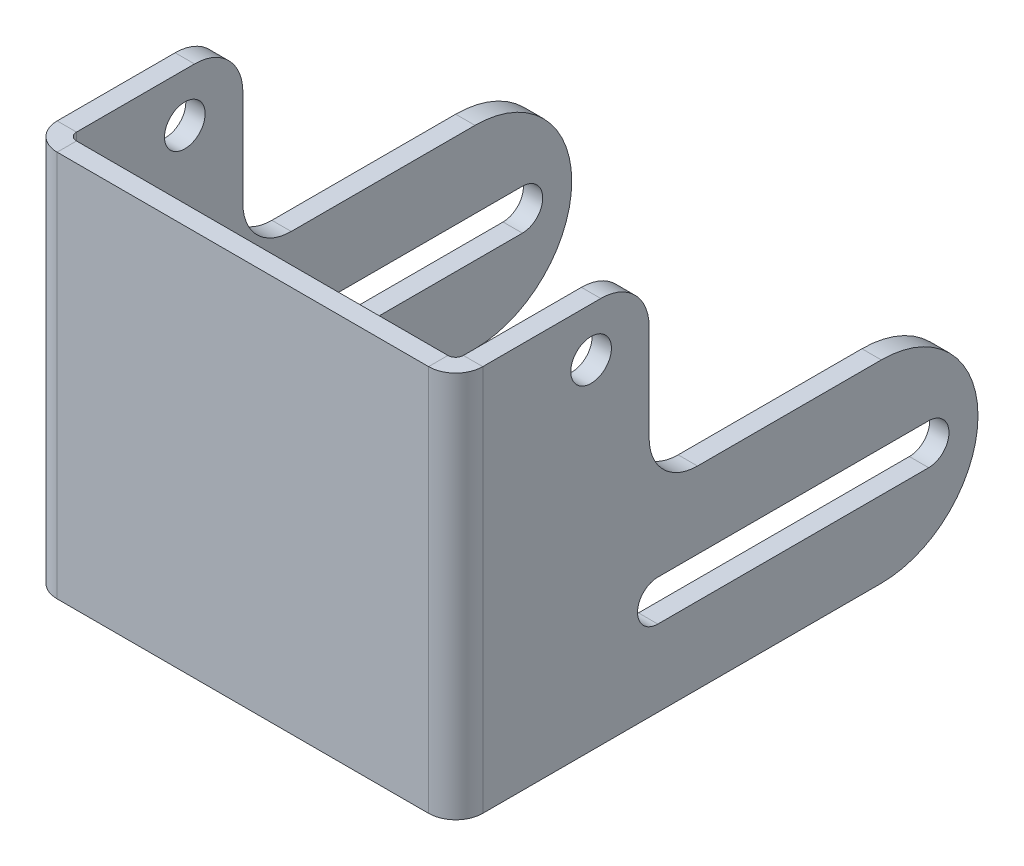
ISO-10303-21;
HEADER;
FILE_DESCRIPTION(('STEP AP214'),'2;1');
FILE_NAME('part.step','',(''),(''),'','','');
FILE_SCHEMA(('AUTOMOTIVE_DESIGN { 1 0 10303 214 1 1 1 1 }'));
ENDSEC;
DATA;
#1=APPLICATION_CONTEXT('core data for automotive mechanical design processes');
#2=APPLICATION_PROTOCOL_DEFINITION('international standard','automotive_design',2000,#1);
#3=PRODUCT_CONTEXT('',#1,'mechanical');
#4=PRODUCT('Part','Part','',(#3));
#5=PRODUCT_RELATED_PRODUCT_CATEGORY('part','',(#4));
#6=PRODUCT_DEFINITION_FORMATION('','',#4);
#7=PRODUCT_DEFINITION_CONTEXT('part definition',#1,'design');
#8=PRODUCT_DEFINITION('design','',#6,#7);
#9=PRODUCT_DEFINITION_SHAPE('','',#8);
#10=(LENGTH_UNIT() NAMED_UNIT(*) SI_UNIT(.MILLI.,.METRE.));
#11=(NAMED_UNIT(*) PLANE_ANGLE_UNIT() SI_UNIT($,.RADIAN.));
#12=(NAMED_UNIT(*) SI_UNIT($,.STERADIAN.) SOLID_ANGLE_UNIT());
#13=UNCERTAINTY_MEASURE_WITH_UNIT(LENGTH_MEASURE(1.E-05),#10,'distance_accuracy_value','');
#14=(GEOMETRIC_REPRESENTATION_CONTEXT(3) GLOBAL_UNCERTAINTY_ASSIGNED_CONTEXT((#13)) GLOBAL_UNIT_ASSIGNED_CONTEXT((#10,
#11,#12)) REPRESENTATION_CONTEXT('',''));
#15=CARTESIAN_POINT('',(0.,0.,0.));
#16=DIRECTION('',(0.,0.,1.));
#17=DIRECTION('',(1.,0.,0.));
#18=AXIS2_PLACEMENT_3D('',#15,#16,#17);
#19=CARTESIAN_POINT('',(-19.2,40.,0.));
#20=DIRECTION('',(0.,1.,0.));
#21=DIRECTION('',(0.,0.,1.));
#22=AXIS2_PLACEMENT_3D('',#19,#20,#21);
#23=PLANE('',#22);
#24=DIRECTION('',(0.,0.,1.));
#25=VECTOR('',#24,1.);
#26=CARTESIAN_POINT('',(-19.2,40.,0.));
#27=LINE('',#26,#25);
#28=CARTESIAN_POINT('',(-19.2,40.,0.));
#29=VERTEX_POINT('',#28);
#30=CARTESIAN_POINT('',(-19.2,40.,1.99999999999999));
#31=VERTEX_POINT('',#30);
#32=EDGE_CURVE('E412',#29,#31,#27,.T.);
#33=ORIENTED_EDGE('',*,*,#32,.F.);
#34=CARTESIAN_POINT('',(-19.2,40.,-0.800000000000008));
#35=DIRECTION('',(0.,-1.,0.));
#36=DIRECTION('',(0.,0.,-1.));
#37=AXIS2_PLACEMENT_3D('',#34,#35,#36);
#38=CIRCLE('',#37,0.8);
#39=CARTESIAN_POINT('',(-20.,40.,-0.800000000000037));
#40=VERTEX_POINT('',#39);
#41=EDGE_CURVE('E343',#29,#40,#38,.T.);
#42=ORIENTED_EDGE('',*,*,#41,.T.);
#43=DIRECTION('',(1.,0.,0.));
#44=VECTOR('',#43,1.);
#45=CARTESIAN_POINT('',(-22.,40.,-0.800000000000037));
#46=LINE('',#45,#44);
#47=CARTESIAN_POINT('',(-22.,40.,-0.800000000000037));
#48=VERTEX_POINT('',#47);
#49=EDGE_CURVE('E410',#48,#40,#46,.T.);
#50=ORIENTED_EDGE('',*,*,#49,.F.);
#51=CARTESIAN_POINT('',(-19.2,40.,-0.800000000000008));
#52=DIRECTION('',(0.,1.,0.));
#53=DIRECTION('',(1.,0.,0.));
#54=AXIS2_PLACEMENT_3D('',#51,#52,#53);
#55=CIRCLE('',#54,2.8);
#56=EDGE_CURVE('E324',#31,#48,#55,.F.);
#57=ORIENTED_EDGE('',*,*,#56,.F.);
#58=EDGE_LOOP('',(#33,#42,#50,#57));
#59=FACE_BOUND('',#58,.T.);
#60=ADVANCED_FACE('F37',(#59),#23,.T.);
#61=CARTESIAN_POINT('',(-22.,40.,-0.800000000000037));
#62=DIRECTION('',(0.,1.,0.));
#63=DIRECTION('',(0.,0.,1.));
#64=AXIS2_PLACEMENT_3D('',#61,#62,#63);
#65=PLANE('',#64);
#66=DIRECTION('',(-1.,0.,0.));
#67=VECTOR('',#66,1.);
#68=CARTESIAN_POINT('',(-20.,40.,0.));
#69=LINE('',#68,#67);
#70=CARTESIAN_POINT('',(19.2,40.,0.));
#71=VERTEX_POINT('',#70);
#72=EDGE_CURVE('E340',#71,#29,#69,.T.);
#73=ORIENTED_EDGE('',*,*,#72,.T.);
#74=ORIENTED_EDGE('',*,*,#32,.T.);
#75=DIRECTION('',(1.,0.,0.));
#76=VECTOR('',#75,1.);
#77=CARTESIAN_POINT('',(-20.,40.,2.));
#78=LINE('',#77,#76);
#79=CARTESIAN_POINT('',(19.2,40.,2.));
#80=VERTEX_POINT('',#79);
#81=EDGE_CURVE('E327',#80,#31,#78,.F.);
#82=ORIENTED_EDGE('',*,*,#81,.F.);
#83=DIRECTION('',(0.,0.,-1.));
#84=VECTOR('',#83,1.);
#85=CARTESIAN_POINT('',(19.2,40.,2.));
#86=LINE('',#85,#84);
#87=EDGE_CURVE('E401',#80,#71,#86,.T.);
#88=ORIENTED_EDGE('',*,*,#87,.T.);
#89=EDGE_LOOP('',(#73,#74,#82,#88));
#90=FACE_BOUND('',#89,.T.);
#91=ADVANCED_FACE('F528',(#90),#65,.T.);
#92=CARTESIAN_POINT('',(-20.,0.,-0.800000000000037));
#93=DIRECTION('',(0.,-1.,0.));
#94=DIRECTION('',(0.,0.,-1.));
#95=AXIS2_PLACEMENT_3D('',#92,#93,#94);
#96=PLANE('',#95);
#97=DIRECTION('',(-1.,0.,0.));
#98=VECTOR('',#97,1.);
#99=CARTESIAN_POINT('',(-20.,0.,-0.800000000000037));
#100=LINE('',#99,#98);
#101=CARTESIAN_POINT('',(-20.,0.,-0.800000000000037));
#102=VERTEX_POINT('',#101);
#103=CARTESIAN_POINT('',(-22.,0.,-0.800000000000037));
#104=VERTEX_POINT('',#103);
#105=EDGE_CURVE('E408',#102,#104,#100,.T.);
#106=ORIENTED_EDGE('',*,*,#105,.F.);
#107=CARTESIAN_POINT('',(-19.2,0.,-0.800000000000008));
#108=DIRECTION('',(0.,-1.,0.));
#109=DIRECTION('',(0.,0.,-1.));
#110=AXIS2_PLACEMENT_3D('',#107,#108,#109);
#111=CIRCLE('',#110,0.8);
#112=CARTESIAN_POINT('',(-19.2,0.,0.));
#113=VERTEX_POINT('',#112);
#114=EDGE_CURVE('E321',#113,#102,#111,.T.);
#115=ORIENTED_EDGE('',*,*,#114,.F.);
#116=DIRECTION('',(0.,0.,-1.));
#117=VECTOR('',#116,1.);
#118=CARTESIAN_POINT('',(-19.2,0.,1.99999999999999));
#119=LINE('',#118,#117);
#120=CARTESIAN_POINT('',(-19.2,0.,1.99999999999999));
#121=VERTEX_POINT('',#120);
#122=EDGE_CURVE('E406',#121,#113,#119,.T.);
#123=ORIENTED_EDGE('',*,*,#122,.F.);
#124=CARTESIAN_POINT('',(-19.2,0.,-0.800000000000008));
#125=DIRECTION('',(0.,1.,0.));
#126=DIRECTION('',(1.,0.,0.));
#127=AXIS2_PLACEMENT_3D('',#124,#125,#126);
#128=CIRCLE('',#127,2.8);
#129=EDGE_CURVE('E352',#121,#104,#128,.F.);
#130=ORIENTED_EDGE('',*,*,#129,.T.);
#131=EDGE_LOOP('',(#106,#115,#123,#130));
#132=FACE_BOUND('',#131,.T.);
#133=ADVANCED_FACE('F534',(#132),#96,.T.);
#134=CARTESIAN_POINT('',(-19.2,0.,1.99999999999999));
#135=DIRECTION('',(0.,-1.,0.));
#136=DIRECTION('',(0.,0.,-1.));
#137=AXIS2_PLACEMENT_3D('',#134,#135,#136);
#138=PLANE('',#137);
#139=DIRECTION('',(0.,0.,-1.));
#140=VECTOR('',#139,1.);
#141=CARTESIAN_POINT('',(-22.,0.,-52.));
#142=LINE('',#141,#140);
#143=CARTESIAN_POINT('',(-22.,0.,-42.));
#144=VERTEX_POINT('',#143);
#145=EDGE_CURVE('E349',#104,#144,#142,.T.);
#146=ORIENTED_EDGE('',*,*,#145,.T.);
#147=DIRECTION('',(1.,0.,0.));
#148=VECTOR('',#147,1.);
#149=CARTESIAN_POINT('',(-19.2,0.,-42.));
#150=LINE('',#149,#148);
#151=CARTESIAN_POINT('',(-20.,0.,-42.));
#152=VERTEX_POINT('',#151);
#153=EDGE_CURVE('E427',#144,#152,#150,.T.);
#154=ORIENTED_EDGE('',*,*,#153,.T.);
#155=DIRECTION('',(0.,0.,-1.));
#156=VECTOR('',#155,1.);
#157=CARTESIAN_POINT('',(-20.,0.,-52.));
#158=LINE('',#157,#156);
#159=EDGE_CURVE('E316',#102,#152,#158,.T.);
#160=ORIENTED_EDGE('',*,*,#159,.F.);
#161=ORIENTED_EDGE('',*,*,#105,.T.);
#162=EDGE_LOOP('',(#146,#154,#160,#161));
#163=FACE_BOUND('',#162,.T.);
#164=ADVANCED_FACE('F623',(#163),#138,.T.);
#165=CARTESIAN_POINT('',(20.,40.,-0.80000000000003));
#166=DIRECTION('',(0.,1.,0.));
#167=DIRECTION('',(0.,0.,1.));
#168=AXIS2_PLACEMENT_3D('',#165,#166,#167);
#169=PLANE('',#168);
#170=DIRECTION('',(1.,0.,0.));
#171=VECTOR('',#170,1.);
#172=CARTESIAN_POINT('',(20.,40.,-0.80000000000003));
#173=LINE('',#172,#171);
#174=CARTESIAN_POINT('',(20.,40.,-0.80000000000003));
#175=VERTEX_POINT('',#174);
#176=CARTESIAN_POINT('',(22.,40.,-0.800000000000102));
#177=VERTEX_POINT('',#176);
#178=EDGE_CURVE('E403',#175,#177,#173,.T.);
#179=ORIENTED_EDGE('',*,*,#178,.F.);
#180=CARTESIAN_POINT('',(19.2,40.,-0.800000000000001));
#181=DIRECTION('',(0.,-1.,0.));
#182=DIRECTION('',(0.,0.,-1.));
#183=AXIS2_PLACEMENT_3D('',#180,#181,#182);
#184=CIRCLE('',#183,0.8);
#185=EDGE_CURVE('E337',#175,#71,#184,.T.);
#186=ORIENTED_EDGE('',*,*,#185,.T.);
#187=ORIENTED_EDGE('',*,*,#87,.F.);
#188=CARTESIAN_POINT('',(19.2,40.,-0.800000000000001));
#189=DIRECTION('',(0.,1.,0.));
#190=DIRECTION('',(1.,0.,0.));
#191=AXIS2_PLACEMENT_3D('',#188,#189,#190);
#192=CIRCLE('',#191,2.8);
#193=EDGE_CURVE('E330',#177,#80,#192,.F.);
#194=ORIENTED_EDGE('',*,*,#193,.F.);
#195=EDGE_LOOP('',(#179,#186,#187,#194));
#196=FACE_BOUND('',#195,.T.);
#197=ADVANCED_FACE('F639',(#196),#169,.T.);
#198=CARTESIAN_POINT('',(19.2,40.,2.));
#199=DIRECTION('',(0.,1.,0.));
#200=DIRECTION('',(0.,0.,1.));
#201=AXIS2_PLACEMENT_3D('',#198,#199,#200);
#202=PLANE('',#201);
#203=DIRECTION('',(0.,0.,1.));
#204=VECTOR('',#203,1.);
#205=CARTESIAN_POINT('',(22.,40.,-52.));
#206=LINE('',#205,#204);
#207=CARTESIAN_POINT('',(22.,40.,-13.));
#208=VERTEX_POINT('',#207);
#209=EDGE_CURVE('E333',#208,#177,#206,.T.);
#210=ORIENTED_EDGE('',*,*,#209,.F.);
#211=DIRECTION('',(1.,0.,0.));
#212=VECTOR('',#211,1.);
#213=CARTESIAN_POINT('',(20.,40.,-13.));
#214=LINE('',#213,#212);
#215=CARTESIAN_POINT('',(20.,40.,-13.));
#216=VERTEX_POINT('',#215);
#217=EDGE_CURVE('E472',#208,#216,#214,.F.);
#218=ORIENTED_EDGE('',*,*,#217,.T.);
#219=DIRECTION('',(0.,0.,1.));
#220=VECTOR('',#219,1.);
#221=CARTESIAN_POINT('',(20.,40.,-52.));
#222=LINE('',#221,#220);
#223=EDGE_CURVE('E335',#216,#175,#222,.T.);
#224=ORIENTED_EDGE('',*,*,#223,.T.);
#225=ORIENTED_EDGE('',*,*,#178,.T.);
#226=EDGE_LOOP('',(#210,#218,#224,#225));
#227=FACE_BOUND('',#226,.T.);
#228=ADVANCED_FACE('F646',(#227),#202,.T.);
#229=CARTESIAN_POINT('',(19.2,0.,0.));
#230=DIRECTION('',(0.,-1.,0.));
#231=DIRECTION('',(0.,0.,-1.));
#232=AXIS2_PLACEMENT_3D('',#229,#230,#231);
#233=PLANE('',#232);
#234=DIRECTION('',(0.,0.,1.));
#235=VECTOR('',#234,1.);
#236=CARTESIAN_POINT('',(19.2,0.,0.));
#237=LINE('',#236,#235);
#238=CARTESIAN_POINT('',(19.2,0.,0.));
#239=VERTEX_POINT('',#238);
#240=CARTESIAN_POINT('',(19.2,0.,2.));
#241=VERTEX_POINT('',#240);
#242=EDGE_CURVE('E399',#239,#241,#237,.T.);
#243=ORIENTED_EDGE('',*,*,#242,.F.);
#244=CARTESIAN_POINT('',(19.2,0.,-0.800000000000001));
#245=DIRECTION('',(0.,-1.,0.));
#246=DIRECTION('',(0.,0.,-1.));
#247=AXIS2_PLACEMENT_3D('',#244,#245,#246);
#248=CIRCLE('',#247,0.8);
#249=CARTESIAN_POINT('',(20.,0.,-0.80000000000003));
#250=VERTEX_POINT('',#249);
#251=EDGE_CURVE('E365',#250,#239,#248,.T.);
#252=ORIENTED_EDGE('',*,*,#251,.F.);
#253=DIRECTION('',(-1.,0.,0.));
#254=VECTOR('',#253,1.);
#255=CARTESIAN_POINT('',(22.,0.,-0.800000000000102));
#256=LINE('',#255,#254);
#257=CARTESIAN_POINT('',(22.,0.,-0.800000000000102));
#258=VERTEX_POINT('',#257);
#259=EDGE_CURVE('E396',#258,#250,#256,.T.);
#260=ORIENTED_EDGE('',*,*,#259,.F.);
#261=CARTESIAN_POINT('',(19.2,0.,-0.800000000000001));
#262=DIRECTION('',(0.,1.,0.));
#263=DIRECTION('',(1.,0.,0.));
#264=AXIS2_PLACEMENT_3D('',#261,#262,#263);
#265=CIRCLE('',#264,2.8);
#266=EDGE_CURVE('E358',#258,#241,#265,.F.);
#267=ORIENTED_EDGE('',*,*,#266,.T.);
#268=EDGE_LOOP('',(#243,#252,#260,#267));
#269=FACE_BOUND('',#268,.T.);
#270=ADVANCED_FACE('F593',(#269),#233,.T.);
#271=CARTESIAN_POINT('',(22.,0.,-0.800000000000102));
#272=DIRECTION('',(0.,-1.,0.));
#273=DIRECTION('',(0.,0.,-1.));
#274=AXIS2_PLACEMENT_3D('',#271,#272,#273);
#275=PLANE('',#274);
#276=DIRECTION('',(-1.,0.,0.));
#277=VECTOR('',#276,1.);
#278=CARTESIAN_POINT('',(-20.,0.,0.));
#279=LINE('',#278,#277);
#280=EDGE_CURVE('E368',#239,#113,#279,.T.);
#281=ORIENTED_EDGE('',*,*,#280,.F.);
#282=ORIENTED_EDGE('',*,*,#242,.T.);
#283=DIRECTION('',(1.,0.,0.));
#284=VECTOR('',#283,1.);
#285=CARTESIAN_POINT('',(-20.,0.,2.));
#286=LINE('',#285,#284);
#287=EDGE_CURVE('E355',#241,#121,#286,.F.);
#288=ORIENTED_EDGE('',*,*,#287,.T.);
#289=ORIENTED_EDGE('',*,*,#122,.T.);
#290=EDGE_LOOP('',(#281,#282,#288,#289));
#291=FACE_BOUND('',#290,.T.);
#292=ADVANCED_FACE('F604',(#291),#275,.T.);
#293=CARTESIAN_POINT('',(-20.,40.,-52.));
#294=DIRECTION('',(-1.,0.,0.));
#295=DIRECTION('',(0.,0.,1.));
#296=AXIS2_PLACEMENT_3D('',#293,#294,#295);
#297=PLANE('',#296);
#298=CARTESIAN_POINT('',(-20.,35.,-12.));
#299=DIRECTION('',(-1.,0.,0.));
#300=DIRECTION('',(0.,0.,1.));
#301=AXIS2_PLACEMENT_3D('',#298,#299,#300);
#302=CIRCLE('',#301,2.1);
#303=CARTESIAN_POINT('',(-20.,35.,-9.9));
#304=VERTEX_POINT('',#303);
#305=EDGE_CURVE('E292',#304,#304,#302,.T.);
#306=ORIENTED_EDGE('',*,*,#305,.T.);
#307=EDGE_LOOP('',(#306));
#308=FACE_BOUND('',#307,.T.);
#309=DIRECTION('',(0.,0.,1.));
#310=VECTOR('',#309,1.);
#311=CARTESIAN_POINT('',(-20.,7.9,-52.));
#312=LINE('',#311,#310);
#313=CARTESIAN_POINT('',(-20.,7.9,-46.9));
#314=VERTEX_POINT('',#313);
#315=CARTESIAN_POINT('',(-20.,7.9,-18.9));
#316=VERTEX_POINT('',#315);
#317=EDGE_CURVE('E282',#314,#316,#312,.T.);
#318=ORIENTED_EDGE('',*,*,#317,.T.);
#319=CARTESIAN_POINT('',(-20.,10.,-18.9));
#320=DIRECTION('',(-1.,0.,0.));
#321=DIRECTION('',(0.,0.,1.));
#322=AXIS2_PLACEMENT_3D('',#319,#320,#321);
#323=CIRCLE('',#322,2.1);
#324=CARTESIAN_POINT('',(-20.,12.1,-18.9));
#325=VERTEX_POINT('',#324);
#326=EDGE_CURVE('E241',#316,#325,#323,.T.);
#327=ORIENTED_EDGE('',*,*,#326,.T.);
#328=DIRECTION('',(0.,0.,-1.));
#329=VECTOR('',#328,1.);
#330=CARTESIAN_POINT('',(-20.,12.1,-52.));
#331=LINE('',#330,#329);
#332=CARTESIAN_POINT('',(-20.,12.1,-46.9));
#333=VERTEX_POINT('',#332);
#334=EDGE_CURVE('E288',#325,#333,#331,.T.);
#335=ORIENTED_EDGE('',*,*,#334,.T.);
#336=CARTESIAN_POINT('',(-20.,10.,-46.9));
#337=DIRECTION('',(-1.,0.,0.));
#338=DIRECTION('',(0.,0.,1.));
#339=AXIS2_PLACEMENT_3D('',#336,#337,#338);
#340=CIRCLE('',#339,2.1);
#341=EDGE_CURVE('E284',#333,#314,#340,.T.);
#342=ORIENTED_EDGE('',*,*,#341,.T.);
#343=EDGE_LOOP('',(#318,#327,#335,#342));
#344=FACE_BOUND('',#343,.T.);
#345=DIRECTION('',(0.,1.,0.));
#346=VECTOR('',#345,1.);
#347=CARTESIAN_POINT('',(-20.,40.,-18.));
#348=LINE('',#347,#346);
#349=CARTESIAN_POINT('',(-20.,25.,-18.));
#350=VERTEX_POINT('',#349);
#351=CARTESIAN_POINT('',(-20.,35.,-18.));
#352=VERTEX_POINT('',#351);
#353=EDGE_CURVE('E310',#350,#352,#348,.T.);
#354=ORIENTED_EDGE('',*,*,#353,.T.);
#355=CARTESIAN_POINT('',(-20.,35.,-13.));
#356=DIRECTION('',(-1.,0.,0.));
#357=DIRECTION('',(0.,0.,1.));
#358=AXIS2_PLACEMENT_3D('',#355,#356,#357);
#359=CIRCLE('',#358,5.);
#360=CARTESIAN_POINT('',(-20.,40.,-13.));
#361=VERTEX_POINT('',#360);
#362=EDGE_CURVE('E453',#352,#361,#359,.F.);
#363=ORIENTED_EDGE('',*,*,#362,.T.);
#364=DIRECTION('',(0.,0.,-1.));
#365=VECTOR('',#364,1.);
#366=CARTESIAN_POINT('',(-20.,40.,-52.));
#367=LINE('',#366,#365);
#368=EDGE_CURVE('E317',#40,#361,#367,.T.);
#369=ORIENTED_EDGE('',*,*,#368,.F.);
#370=DIRECTION('',(0.,-1.,0.));
#371=VECTOR('',#370,1.);
#372=CARTESIAN_POINT('',(-20.,40.,-0.800000000000037));
#373=LINE('',#372,#371);
#374=EDGE_CURVE('E346',#40,#102,#373,.T.);
#375=ORIENTED_EDGE('',*,*,#374,.T.);
#376=ORIENTED_EDGE('',*,*,#159,.T.);
#377=CARTESIAN_POINT('',(-20.,10.,-42.));
#378=DIRECTION('',(-1.,0.,0.));
#379=DIRECTION('',(0.,0.,1.));
#380=AXIS2_PLACEMENT_3D('',#377,#378,#379);
#381=CIRCLE('',#380,10.);
#382=CARTESIAN_POINT('',(-20.,10.,-52.));
#383=VERTEX_POINT('',#382);
#384=EDGE_CURVE('E416',#152,#383,#381,.F.);
#385=ORIENTED_EDGE('',*,*,#384,.T.);
#386=CARTESIAN_POINT('',(-20.,10.,-42.));
#387=DIRECTION('',(-1.,0.,0.));
#388=DIRECTION('',(0.,0.,1.));
#389=AXIS2_PLACEMENT_3D('',#386,#387,#388);
#390=CIRCLE('',#389,10.);
#391=CARTESIAN_POINT('',(-20.,20.,-42.));
#392=VERTEX_POINT('',#391);
#393=EDGE_CURVE('E418',#383,#392,#390,.F.);
#394=ORIENTED_EDGE('',*,*,#393,.T.);
#395=DIRECTION('',(0.,0.,1.));
#396=VECTOR('',#395,1.);
#397=CARTESIAN_POINT('',(-20.,20.,-52.));
#398=LINE('',#397,#396);
#399=CARTESIAN_POINT('',(-20.,20.,-23.));
#400=VERTEX_POINT('',#399);
#401=EDGE_CURVE('E313',#392,#400,#398,.T.);
#402=ORIENTED_EDGE('',*,*,#401,.T.);
#403=CARTESIAN_POINT('',(-20.,25.,-23.));
#404=DIRECTION('',(-1.,0.,0.));
#405=DIRECTION('',(0.,0.,1.));
#406=AXIS2_PLACEMENT_3D('',#403,#404,#405);
#407=CIRCLE('',#406,5.);
#408=EDGE_CURVE('E476',#400,#350,#407,.T.);
#409=ORIENTED_EDGE('',*,*,#408,.T.);
#410=EDGE_LOOP('',(#354,#363,#369,#375,#376,#385,#394,#402,#409));
#411=FACE_BOUND('',#410,.T.);
#412=ADVANCED_FACE('F629',(#308,#344,#411),#297,.F.);
#413=CARTESIAN_POINT('',(-22.,40.,-52.));
#414=DIRECTION('',(-1.,0.,0.));
#415=DIRECTION('',(0.,0.,1.));
#416=AXIS2_PLACEMENT_3D('',#413,#414,#415);
#417=PLANE('',#416);
#418=CARTESIAN_POINT('',(-22.,35.,-12.));
#419=DIRECTION('',(1.,0.,0.));
#420=DIRECTION('',(0.,0.,-1.));
#421=AXIS2_PLACEMENT_3D('',#418,#419,#420);
#422=CIRCLE('',#421,2.1);
#423=CARTESIAN_POINT('',(-22.,35.,-14.1));
#424=VERTEX_POINT('',#423);
#425=EDGE_CURVE('E285',#424,#424,#422,.T.);
#426=ORIENTED_EDGE('',*,*,#425,.T.);
#427=EDGE_LOOP('',(#426));
#428=FACE_BOUND('',#427,.T.);
#429=CARTESIAN_POINT('',(-22.,10.,-18.9));
#430=DIRECTION('',(1.,0.,0.));
#431=DIRECTION('',(0.,0.,-1.));
#432=AXIS2_PLACEMENT_3D('',#429,#430,#431);
#433=CIRCLE('',#432,2.1);
#434=CARTESIAN_POINT('',(-22.,12.1,-18.9));
#435=VERTEX_POINT('',#434);
#436=CARTESIAN_POINT('',(-22.,7.9,-18.9));
#437=VERTEX_POINT('',#436);
#438=EDGE_CURVE('E238',#435,#437,#433,.T.);
#439=ORIENTED_EDGE('',*,*,#438,.T.);
#440=DIRECTION('',(0.,0.,-1.));
#441=VECTOR('',#440,1.);
#442=CARTESIAN_POINT('',(-22.,7.9,-18.9));
#443=LINE('',#442,#441);
#444=CARTESIAN_POINT('',(-22.,7.9,-46.9));
#445=VERTEX_POINT('',#444);
#446=EDGE_CURVE('E247',#437,#445,#443,.T.);
#447=ORIENTED_EDGE('',*,*,#446,.T.);
#448=CARTESIAN_POINT('',(-22.,10.,-46.9));
#449=DIRECTION('',(1.,0.,0.));
#450=DIRECTION('',(0.,0.,-1.));
#451=AXIS2_PLACEMENT_3D('',#448,#449,#450);
#452=CIRCLE('',#451,2.1);
#453=CARTESIAN_POINT('',(-22.,12.1,-46.9));
#454=VERTEX_POINT('',#453);
#455=EDGE_CURVE('E61',#445,#454,#452,.T.);
#456=ORIENTED_EDGE('',*,*,#455,.T.);
#457=DIRECTION('',(0.,0.,1.));
#458=VECTOR('',#457,1.);
#459=CARTESIAN_POINT('',(-22.,12.1,-18.9));
#460=LINE('',#459,#458);
#461=EDGE_CURVE('E255',#454,#435,#460,.T.);
#462=ORIENTED_EDGE('',*,*,#461,.T.);
#463=EDGE_LOOP('',(#439,#447,#456,#462));
#464=FACE_BOUND('',#463,.T.);
#465=DIRECTION('',(0.,0.,-1.));
#466=VECTOR('',#465,1.);
#467=CARTESIAN_POINT('',(-22.,40.,-52.));
#468=LINE('',#467,#466);
#469=CARTESIAN_POINT('',(-22.,40.,-13.));
#470=VERTEX_POINT('',#469);
#471=EDGE_CURVE('E320',#48,#470,#468,.T.);
#472=ORIENTED_EDGE('',*,*,#471,.T.);
#473=CARTESIAN_POINT('',(-22.,35.,-13.));
#474=DIRECTION('',(-1.,0.,0.));
#475=DIRECTION('',(0.,0.,1.));
#476=AXIS2_PLACEMENT_3D('',#473,#474,#475);
#477=CIRCLE('',#476,5.);
#478=CARTESIAN_POINT('',(-22.,35.,-18.));
#479=VERTEX_POINT('',#478);
#480=EDGE_CURVE('E457',#470,#479,#477,.T.);
#481=ORIENTED_EDGE('',*,*,#480,.T.);
#482=DIRECTION('',(0.,-1.,0.));
#483=VECTOR('',#482,1.);
#484=CARTESIAN_POINT('',(-22.,40.,-18.));
#485=LINE('',#484,#483);
#486=CARTESIAN_POINT('',(-22.,25.,-18.));
#487=VERTEX_POINT('',#486);
#488=EDGE_CURVE('E296',#479,#487,#485,.T.);
#489=ORIENTED_EDGE('',*,*,#488,.T.);
#490=CARTESIAN_POINT('',(-22.,25.,-23.));
#491=DIRECTION('',(-1.,0.,0.));
#492=DIRECTION('',(0.,0.,1.));
#493=AXIS2_PLACEMENT_3D('',#490,#491,#492);
#494=CIRCLE('',#493,5.);
#495=CARTESIAN_POINT('',(-22.,20.,-23.));
#496=VERTEX_POINT('',#495);
#497=EDGE_CURVE('E478',#487,#496,#494,.F.);
#498=ORIENTED_EDGE('',*,*,#497,.T.);
#499=DIRECTION('',(0.,0.,-1.));
#500=VECTOR('',#499,1.);
#501=CARTESIAN_POINT('',(-22.,20.,-18.));
#502=LINE('',#501,#500);
#503=CARTESIAN_POINT('',(-22.,20.,-42.));
#504=VERTEX_POINT('',#503);
#505=EDGE_CURVE('E299',#496,#504,#502,.T.);
#506=ORIENTED_EDGE('',*,*,#505,.T.);
#507=CARTESIAN_POINT('',(-22.,10.,-42.));
#508=DIRECTION('',(-1.,0.,0.));
#509=DIRECTION('',(0.,0.,1.));
#510=AXIS2_PLACEMENT_3D('',#507,#508,#509);
#511=CIRCLE('',#510,10.);
#512=CARTESIAN_POINT('',(-22.,10.,-52.));
#513=VERTEX_POINT('',#512);
#514=EDGE_CURVE('E425',#504,#513,#511,.T.);
#515=ORIENTED_EDGE('',*,*,#514,.T.);
#516=CARTESIAN_POINT('',(-22.,10.,-42.));
#517=DIRECTION('',(-1.,0.,0.));
#518=DIRECTION('',(0.,0.,1.));
#519=AXIS2_PLACEMENT_3D('',#516,#517,#518);
#520=CIRCLE('',#519,10.);
#521=EDGE_CURVE('E423',#513,#144,#520,.T.);
#522=ORIENTED_EDGE('',*,*,#521,.T.);
#523=ORIENTED_EDGE('',*,*,#145,.F.);
#524=DIRECTION('',(0.,-1.,0.));
#525=VECTOR('',#524,1.);
#526=CARTESIAN_POINT('',(-22.,40.,-0.800000000000037));
#527=LINE('',#526,#525);
#528=EDGE_CURVE('E393',#48,#104,#527,.T.);
#529=ORIENTED_EDGE('',*,*,#528,.F.);
#530=EDGE_LOOP('',(#472,#481,#489,#498,#506,#515,#522,#523,#529));
#531=FACE_BOUND('',#530,.T.);
#532=ADVANCED_FACE('F252',(#428,#464,#531),#417,.T.);
#533=CARTESIAN_POINT('',(-19.2,40.,-0.800000000000008));
#534=DIRECTION('',(0.,-1.,0.));
#535=DIRECTION('',(0.,0.,-1.));
#536=AXIS2_PLACEMENT_3D('',#533,#534,#535);
#537=CYLINDRICAL_SURFACE('',#536,2.8);
#538=ORIENTED_EDGE('',*,*,#129,.F.);
#539=DIRECTION('',(0.,-1.,0.));
#540=VECTOR('',#539,1.);
#541=CARTESIAN_POINT('',(-19.2,40.,1.99999999999999));
#542=LINE('',#541,#540);
#543=EDGE_CURVE('E390',#31,#121,#542,.T.);
#544=ORIENTED_EDGE('',*,*,#543,.F.);
#545=ORIENTED_EDGE('',*,*,#56,.T.);
#546=ORIENTED_EDGE('',*,*,#528,.T.);
#547=EDGE_LOOP('',(#538,#544,#545,#546));
#548=FACE_BOUND('',#547,.T.);
#549=ADVANCED_FACE('F616',(#548),#537,.T.);
#550=CARTESIAN_POINT('',(-20.,40.,2.));
#551=DIRECTION('',(0.,0.,1.));
#552=DIRECTION('',(1.,0.,0.));
#553=AXIS2_PLACEMENT_3D('',#550,#551,#552);
#554=PLANE('',#553);
#555=ORIENTED_EDGE('',*,*,#287,.F.);
#556=DIRECTION('',(0.,-1.,0.));
#557=VECTOR('',#556,1.);
#558=CARTESIAN_POINT('',(19.2,40.,2.));
#559=LINE('',#558,#557);
#560=EDGE_CURVE('E387',#80,#241,#559,.T.);
#561=ORIENTED_EDGE('',*,*,#560,.F.);
#562=ORIENTED_EDGE('',*,*,#81,.T.);
#563=ORIENTED_EDGE('',*,*,#543,.T.);
#564=EDGE_LOOP('',(#555,#561,#562,#563));
#565=FACE_BOUND('',#564,.T.);
#566=ADVANCED_FACE('F611',(#565),#554,.T.);
#567=CARTESIAN_POINT('',(19.2,40.,-0.800000000000001));
#568=DIRECTION('',(0.,-1.,0.));
#569=DIRECTION('',(0.,0.,-1.));
#570=AXIS2_PLACEMENT_3D('',#567,#568,#569);
#571=CYLINDRICAL_SURFACE('',#570,2.8);
#572=ORIENTED_EDGE('',*,*,#266,.F.);
#573=DIRECTION('',(0.,-1.,0.));
#574=VECTOR('',#573,1.);
#575=CARTESIAN_POINT('',(22.,40.,-0.800000000000102));
#576=LINE('',#575,#574);
#577=EDGE_CURVE('E384',#177,#258,#576,.T.);
#578=ORIENTED_EDGE('',*,*,#577,.F.);
#579=ORIENTED_EDGE('',*,*,#193,.T.);
#580=ORIENTED_EDGE('',*,*,#560,.T.);
#581=EDGE_LOOP('',(#572,#578,#579,#580));
#582=FACE_BOUND('',#581,.T.);
#583=ADVANCED_FACE('F712',(#582),#571,.T.);
#584=CARTESIAN_POINT('',(22.,40.,-52.));
#585=DIRECTION('',(1.,0.,0.));
#586=DIRECTION('',(0.,0.,-1.));
#587=AXIS2_PLACEMENT_3D('',#584,#585,#586);
#588=PLANE('',#587);
#589=CARTESIAN_POINT('',(22.,35.,-12.));
#590=DIRECTION('',(1.,0.,0.));
#591=DIRECTION('',(0.,0.,-1.));
#592=AXIS2_PLACEMENT_3D('',#589,#590,#591);
#593=CIRCLE('',#592,2.1);
#594=CARTESIAN_POINT('',(22.,35.,-14.1));
#595=VERTEX_POINT('',#594);
#596=EDGE_CURVE('E262',#595,#595,#593,.T.);
#597=ORIENTED_EDGE('',*,*,#596,.F.);
#598=EDGE_LOOP('',(#597));
#599=FACE_BOUND('',#598,.T.);
#600=CARTESIAN_POINT('',(22.,10.,-18.9));
#601=DIRECTION('',(1.,0.,0.));
#602=DIRECTION('',(0.,0.,-1.));
#603=AXIS2_PLACEMENT_3D('',#600,#601,#602);
#604=CIRCLE('',#603,2.1);
#605=CARTESIAN_POINT('',(22.,12.1,-18.9));
#606=VERTEX_POINT('',#605);
#607=CARTESIAN_POINT('',(22.,7.9,-18.9));
#608=VERTEX_POINT('',#607);
#609=EDGE_CURVE('E267',#606,#608,#604,.T.);
#610=ORIENTED_EDGE('',*,*,#609,.F.);
#611=DIRECTION('',(0.,0.,1.));
#612=VECTOR('',#611,1.);
#613=CARTESIAN_POINT('',(22.,12.1,-18.9));
#614=LINE('',#613,#612);
#615=CARTESIAN_POINT('',(22.,12.1,-46.9));
#616=VERTEX_POINT('',#615);
#617=EDGE_CURVE('E256',#616,#606,#614,.T.);
#618=ORIENTED_EDGE('',*,*,#617,.F.);
#619=CARTESIAN_POINT('',(22.,10.,-46.9));
#620=DIRECTION('',(1.,0.,0.));
#621=DIRECTION('',(0.,0.,-1.));
#622=AXIS2_PLACEMENT_3D('',#619,#620,#621);
#623=CIRCLE('',#622,2.1);
#624=CARTESIAN_POINT('',(22.,7.9,-46.9));
#625=VERTEX_POINT('',#624);
#626=EDGE_CURVE('E259',#625,#616,#623,.T.);
#627=ORIENTED_EDGE('',*,*,#626,.F.);
#628=DIRECTION('',(0.,0.,-1.));
#629=VECTOR('',#628,1.);
#630=CARTESIAN_POINT('',(22.,7.9,-18.9));
#631=LINE('',#630,#629);
#632=EDGE_CURVE('E269',#608,#625,#631,.T.);
#633=ORIENTED_EDGE('',*,*,#632,.F.);
#634=EDGE_LOOP('',(#610,#618,#627,#633));
#635=FACE_BOUND('',#634,.T.);
#636=DIRECTION('',(0.,-1.,0.));
#637=VECTOR('',#636,1.);
#638=CARTESIAN_POINT('',(22.,40.,-18.));
#639=LINE('',#638,#637);
#640=CARTESIAN_POINT('',(22.,35.,-18.));
#641=VERTEX_POINT('',#640);
#642=CARTESIAN_POINT('',(22.,25.,-18.));
#643=VERTEX_POINT('',#642);
#644=EDGE_CURVE('E303',#641,#643,#639,.T.);
#645=ORIENTED_EDGE('',*,*,#644,.F.);
#646=CARTESIAN_POINT('',(22.,35.,-13.));
#647=DIRECTION('',(1.,0.,0.));
#648=DIRECTION('',(0.,0.,-1.));
#649=AXIS2_PLACEMENT_3D('',#646,#647,#648);
#650=CIRCLE('',#649,5.);
#651=EDGE_CURVE('E470',#641,#208,#650,.T.);
#652=ORIENTED_EDGE('',*,*,#651,.T.);
#653=ORIENTED_EDGE('',*,*,#209,.T.);
#654=ORIENTED_EDGE('',*,*,#577,.T.);
#655=DIRECTION('',(0.,0.,1.));
#656=VECTOR('',#655,1.);
#657=CARTESIAN_POINT('',(22.,0.,-52.));
#658=LINE('',#657,#656);
#659=CARTESIAN_POINT('',(22.,0.,-42.));
#660=VERTEX_POINT('',#659);
#661=EDGE_CURVE('E361',#660,#258,#658,.T.);
#662=ORIENTED_EDGE('',*,*,#661,.F.);
#663=CARTESIAN_POINT('',(22.,10.,-42.));
#664=DIRECTION('',(1.,0.,0.));
#665=DIRECTION('',(0.,0.,-1.));
#666=AXIS2_PLACEMENT_3D('',#663,#664,#665);
#667=CIRCLE('',#666,10.);
#668=CARTESIAN_POINT('',(22.,10.,-52.));
#669=VERTEX_POINT('',#668);
#670=EDGE_CURVE('E435',#660,#669,#667,.T.);
#671=ORIENTED_EDGE('',*,*,#670,.T.);
#672=CARTESIAN_POINT('',(22.,10.,-42.));
#673=DIRECTION('',(1.,0.,0.));
#674=DIRECTION('',(0.,0.,-1.));
#675=AXIS2_PLACEMENT_3D('',#672,#673,#674);
#676=CIRCLE('',#675,10.);
#677=CARTESIAN_POINT('',(22.,20.,-42.));
#678=VERTEX_POINT('',#677);
#679=EDGE_CURVE('E432',#669,#678,#676,.T.);
#680=ORIENTED_EDGE('',*,*,#679,.T.);
#681=DIRECTION('',(0.,0.,-1.));
#682=VECTOR('',#681,1.);
#683=CARTESIAN_POINT('',(22.,20.,-18.));
#684=LINE('',#683,#682);
#685=CARTESIAN_POINT('',(22.,20.,-23.));
#686=VERTEX_POINT('',#685);
#687=EDGE_CURVE('E300',#686,#678,#684,.T.);
#688=ORIENTED_EDGE('',*,*,#687,.F.);
#689=CARTESIAN_POINT('',(22.,25.,-23.));
#690=DIRECTION('',(1.,0.,0.));
#691=DIRECTION('',(0.,0.,-1.));
#692=AXIS2_PLACEMENT_3D('',#689,#690,#691);
#693=CIRCLE('',#692,5.);
#694=EDGE_CURVE('E480',#686,#643,#693,.F.);
#695=ORIENTED_EDGE('',*,*,#694,.T.);
#696=EDGE_LOOP('',(#645,#652,#653,#654,#662,#671,#680,#688,#695));
#697=FACE_BOUND('',#696,.T.);
#698=ADVANCED_FACE('F506',(#599,#635,#697),#588,.T.);
#699=CARTESIAN_POINT('',(20.,40.,-52.));
#700=DIRECTION('',(1.,0.,0.));
#701=DIRECTION('',(0.,0.,-1.));
#702=AXIS2_PLACEMENT_3D('',#699,#700,#701);
#703=PLANE('',#702);
#704=CARTESIAN_POINT('',(20.,35.,-12.));
#705=DIRECTION('',(1.,0.,0.));
#706=DIRECTION('',(0.,0.,-1.));
#707=AXIS2_PLACEMENT_3D('',#704,#705,#706);
#708=CIRCLE('',#707,2.1);
#709=CARTESIAN_POINT('',(20.,35.,-14.1));
#710=VERTEX_POINT('',#709);
#711=EDGE_CURVE('E41',#710,#710,#708,.T.);
#712=ORIENTED_EDGE('',*,*,#711,.T.);
#713=EDGE_LOOP('',(#712));
#714=FACE_BOUND('',#713,.T.);
#715=DIRECTION('',(0.,0.,1.));
#716=VECTOR('',#715,1.);
#717=CARTESIAN_POINT('',(20.,12.1,-52.));
#718=LINE('',#717,#716);
#719=CARTESIAN_POINT('',(20.,12.1,-46.9));
#720=VERTEX_POINT('',#719);
#721=CARTESIAN_POINT('',(20.,12.1,-18.9));
#722=VERTEX_POINT('',#721);
#723=EDGE_CURVE('E46',#720,#722,#718,.T.);
#724=ORIENTED_EDGE('',*,*,#723,.T.);
#725=CARTESIAN_POINT('',(20.,10.,-18.9));
#726=DIRECTION('',(1.,0.,0.));
#727=DIRECTION('',(0.,0.,-1.));
#728=AXIS2_PLACEMENT_3D('',#725,#726,#727);
#729=CIRCLE('',#728,2.1);
#730=CARTESIAN_POINT('',(20.,7.9,-18.9));
#731=VERTEX_POINT('',#730);
#732=EDGE_CURVE('E11',#722,#731,#729,.T.);
#733=ORIENTED_EDGE('',*,*,#732,.T.);
#734=DIRECTION('',(0.,0.,-1.));
#735=VECTOR('',#734,1.);
#736=CARTESIAN_POINT('',(20.,7.9,-52.));
#737=LINE('',#736,#735);
#738=CARTESIAN_POINT('',(20.,7.9,-46.9));
#739=VERTEX_POINT('',#738);
#740=EDGE_CURVE('E484',#731,#739,#737,.T.);
#741=ORIENTED_EDGE('',*,*,#740,.T.);
#742=CARTESIAN_POINT('',(20.,10.,-46.9));
#743=DIRECTION('',(1.,0.,0.));
#744=DIRECTION('',(0.,0.,-1.));
#745=AXIS2_PLACEMENT_3D('',#742,#743,#744);
#746=CIRCLE('',#745,2.1);
#747=EDGE_CURVE('E487',#739,#720,#746,.T.);
#748=ORIENTED_EDGE('',*,*,#747,.T.);
#749=EDGE_LOOP('',(#724,#733,#741,#748));
#750=FACE_BOUND('',#749,.T.);
#751=ORIENTED_EDGE('',*,*,#223,.F.);
#752=CARTESIAN_POINT('',(20.,35.,-13.));
#753=DIRECTION('',(1.,0.,0.));
#754=DIRECTION('',(0.,0.,-1.));
#755=AXIS2_PLACEMENT_3D('',#752,#753,#754);
#756=CIRCLE('',#755,5.);
#757=CARTESIAN_POINT('',(20.,35.,-18.));
#758=VERTEX_POINT('',#757);
#759=EDGE_CURVE('E474',#216,#758,#756,.F.);
#760=ORIENTED_EDGE('',*,*,#759,.T.);
#761=DIRECTION('',(0.,-1.,0.));
#762=VECTOR('',#761,1.);
#763=CARTESIAN_POINT('',(20.,40.,-18.));
#764=LINE('',#763,#762);
#765=CARTESIAN_POINT('',(20.,25.,-18.));
#766=VERTEX_POINT('',#765);
#767=EDGE_CURVE('E302',#758,#766,#764,.T.);
#768=ORIENTED_EDGE('',*,*,#767,.T.);
#769=CARTESIAN_POINT('',(20.,25.,-23.));
#770=DIRECTION('',(1.,0.,0.));
#771=DIRECTION('',(0.,0.,-1.));
#772=AXIS2_PLACEMENT_3D('',#769,#770,#771);
#773=CIRCLE('',#772,5.);
#774=CARTESIAN_POINT('',(20.,20.,-23.));
#775=VERTEX_POINT('',#774);
#776=EDGE_CURVE('E482',#766,#775,#773,.T.);
#777=ORIENTED_EDGE('',*,*,#776,.T.);
#778=DIRECTION('',(0.,0.,-1.));
#779=VECTOR('',#778,1.);
#780=CARTESIAN_POINT('',(20.,20.,-52.));
#781=LINE('',#780,#779);
#782=CARTESIAN_POINT('',(20.,20.,-42.));
#783=VERTEX_POINT('',#782);
#784=EDGE_CURVE('E414',#775,#783,#781,.T.);
#785=ORIENTED_EDGE('',*,*,#784,.T.);
#786=CARTESIAN_POINT('',(20.,10.,-42.));
#787=DIRECTION('',(1.,0.,0.));
#788=DIRECTION('',(0.,0.,-1.));
#789=AXIS2_PLACEMENT_3D('',#786,#787,#788);
#790=CIRCLE('',#789,10.);
#791=CARTESIAN_POINT('',(20.,10.,-52.));
#792=VERTEX_POINT('',#791);
#793=EDGE_CURVE('E437',#783,#792,#790,.F.);
#794=ORIENTED_EDGE('',*,*,#793,.T.);
#795=CARTESIAN_POINT('',(20.,10.,-42.));
#796=DIRECTION('',(1.,0.,0.));
#797=DIRECTION('',(0.,0.,-1.));
#798=AXIS2_PLACEMENT_3D('',#795,#796,#797);
#799=CIRCLE('',#798,10.);
#800=CARTESIAN_POINT('',(20.,0.,-42.));
#801=VERTEX_POINT('',#800);
#802=EDGE_CURVE('E439',#792,#801,#799,.F.);
#803=ORIENTED_EDGE('',*,*,#802,.T.);
#804=DIRECTION('',(0.,0.,1.));
#805=VECTOR('',#804,1.);
#806=CARTESIAN_POINT('',(20.,0.,-52.));
#807=LINE('',#806,#805);
#808=EDGE_CURVE('E363',#801,#250,#807,.T.);
#809=ORIENTED_EDGE('',*,*,#808,.T.);
#810=DIRECTION('',(0.,-1.,0.));
#811=VECTOR('',#810,1.);
#812=CARTESIAN_POINT('',(20.,40.,-0.80000000000003));
#813=LINE('',#812,#811);
#814=EDGE_CURVE('E381',#175,#250,#813,.T.);
#815=ORIENTED_EDGE('',*,*,#814,.F.);
#816=EDGE_LOOP('',(#751,#760,#768,#777,#785,#794,#803,#809,#815));
#817=FACE_BOUND('',#816,.T.);
#818=ADVANCED_FACE('F492',(#714,#750,#817),#703,.F.);
#819=CARTESIAN_POINT('',(19.2,40.,-0.800000000000001));
#820=DIRECTION('',(0.,-1.,0.));
#821=DIRECTION('',(0.,0.,-1.));
#822=AXIS2_PLACEMENT_3D('',#819,#820,#821);
#823=CYLINDRICAL_SURFACE('',#822,0.8);
#824=ORIENTED_EDGE('',*,*,#251,.T.);
#825=DIRECTION('',(0.,-1.,0.));
#826=VECTOR('',#825,1.);
#827=CARTESIAN_POINT('',(19.2,40.,0.));
#828=LINE('',#827,#826);
#829=EDGE_CURVE('E378',#71,#239,#828,.T.);
#830=ORIENTED_EDGE('',*,*,#829,.F.);
#831=ORIENTED_EDGE('',*,*,#185,.F.);
#832=ORIENTED_EDGE('',*,*,#814,.T.);
#833=EDGE_LOOP('',(#824,#830,#831,#832));
#834=FACE_BOUND('',#833,.T.);
#835=ADVANCED_FACE('F596',(#834),#823,.F.);
#836=CARTESIAN_POINT('',(-20.,40.,0.));
#837=DIRECTION('',(0.,0.,1.));
#838=DIRECTION('',(1.,0.,0.));
#839=AXIS2_PLACEMENT_3D('',#836,#837,#838);
#840=PLANE('',#839);
#841=ORIENTED_EDGE('',*,*,#280,.T.);
#842=DIRECTION('',(0.,-1.,0.));
#843=VECTOR('',#842,1.);
#844=CARTESIAN_POINT('',(-19.2,40.,0.));
#845=LINE('',#844,#843);
#846=EDGE_CURVE('E375',#29,#113,#845,.T.);
#847=ORIENTED_EDGE('',*,*,#846,.F.);
#848=ORIENTED_EDGE('',*,*,#72,.F.);
#849=ORIENTED_EDGE('',*,*,#829,.T.);
#850=EDGE_LOOP('',(#841,#847,#848,#849));
#851=FACE_BOUND('',#850,.T.);
#852=ADVANCED_FACE('F601',(#851),#840,.F.);
#853=CARTESIAN_POINT('',(-19.2,40.,-0.800000000000008));
#854=DIRECTION('',(0.,-1.,0.));
#855=DIRECTION('',(0.,0.,-1.));
#856=AXIS2_PLACEMENT_3D('',#853,#854,#855);
#857=CYLINDRICAL_SURFACE('',#856,0.8);
#858=ORIENTED_EDGE('',*,*,#114,.T.);
#859=ORIENTED_EDGE('',*,*,#374,.F.);
#860=ORIENTED_EDGE('',*,*,#41,.F.);
#861=ORIENTED_EDGE('',*,*,#846,.T.);
#862=EDGE_LOOP('',(#858,#859,#860,#861));
#863=FACE_BOUND('',#862,.T.);
#864=ADVANCED_FACE('F635',(#863),#857,.F.);
#865=CARTESIAN_POINT('',(-19.2,40.,-0.800000000000008));
#866=DIRECTION('',(0.,1.,0.));
#867=DIRECTION('',(1.,0.,0.));
#868=AXIS2_PLACEMENT_3D('',#865,#866,#867);
#869=PLANE('',#868);
#870=ORIENTED_EDGE('',*,*,#368,.T.);
#871=DIRECTION('',(1.,0.,0.));
#872=VECTOR('',#871,1.);
#873=CARTESIAN_POINT('',(-22.,40.,-13.));
#874=LINE('',#873,#872);
#875=EDGE_CURVE('E455',#361,#470,#874,.F.);
#876=ORIENTED_EDGE('',*,*,#875,.T.);
#877=ORIENTED_EDGE('',*,*,#471,.F.);
#878=ORIENTED_EDGE('',*,*,#49,.T.);
#879=EDGE_LOOP('',(#870,#876,#877,#878));
#880=FACE_BOUND('',#879,.T.);
#881=ADVANCED_FACE('F752',(#880),#869,.T.);
#882=CARTESIAN_POINT('',(-19.2,0.,-0.800000000000008));
#883=DIRECTION('',(0.,1.,0.));
#884=DIRECTION('',(1.,0.,0.));
#885=AXIS2_PLACEMENT_3D('',#882,#883,#884);
#886=PLANE('',#885);
#887=ORIENTED_EDGE('',*,*,#808,.F.);
#888=DIRECTION('',(1.,0.,0.));
#889=VECTOR('',#888,1.);
#890=CARTESIAN_POINT('',(22.,0.,-42.));
#891=LINE('',#890,#889);
#892=EDGE_CURVE('E429',#801,#660,#891,.T.);
#893=ORIENTED_EDGE('',*,*,#892,.T.);
#894=ORIENTED_EDGE('',*,*,#661,.T.);
#895=ORIENTED_EDGE('',*,*,#259,.T.);
#896=EDGE_LOOP('',(#887,#893,#894,#895));
#897=FACE_BOUND('',#896,.T.);
#898=ADVANCED_FACE('F585',(#897),#886,.F.);
#899=CARTESIAN_POINT('',(-22.,40.,-18.));
#900=DIRECTION('',(0.,0.,1.));
#901=DIRECTION('',(0.,-1.,0.));
#902=AXIS2_PLACEMENT_3D('',#899,#900,#901);
#903=PLANE('',#902);
#904=ORIENTED_EDGE('',*,*,#488,.F.);
#905=DIRECTION('',(1.,0.,0.));
#906=VECTOR('',#905,1.);
#907=CARTESIAN_POINT('',(-20.,35.,-18.));
#908=LINE('',#907,#906);
#909=EDGE_CURVE('E450',#479,#352,#908,.T.);
#910=ORIENTED_EDGE('',*,*,#909,.T.);
#911=ORIENTED_EDGE('',*,*,#353,.F.);
#912=DIRECTION('',(1.,0.,0.));
#913=VECTOR('',#912,1.);
#914=CARTESIAN_POINT('',(-22.,25.,-18.));
#915=LINE('',#914,#913);
#916=EDGE_CURVE('E444',#350,#487,#915,.F.);
#917=ORIENTED_EDGE('',*,*,#916,.T.);
#918=EDGE_LOOP('',(#904,#910,#911,#917));
#919=FACE_BOUND('',#918,.T.);
#920=ADVANCED_FACE('F769',(#919),#903,.F.);
#921=CARTESIAN_POINT('',(-22.,20.,-18.));
#922=DIRECTION('',(0.,-1.,0.));
#923=DIRECTION('',(0.,0.,-1.));
#924=AXIS2_PLACEMENT_3D('',#921,#922,#923);
#925=PLANE('',#924);
#926=ORIENTED_EDGE('',*,*,#505,.F.);
#927=DIRECTION('',(1.,0.,0.));
#928=VECTOR('',#927,1.);
#929=CARTESIAN_POINT('',(-20.,20.,-23.));
#930=LINE('',#929,#928);
#931=EDGE_CURVE('E459',#496,#400,#930,.T.);
#932=ORIENTED_EDGE('',*,*,#931,.T.);
#933=ORIENTED_EDGE('',*,*,#401,.F.);
#934=DIRECTION('',(1.,0.,0.));
#935=VECTOR('',#934,1.);
#936=CARTESIAN_POINT('',(-22.,20.,-42.));
#937=LINE('',#936,#935);
#938=EDGE_CURVE('E420',#392,#504,#937,.F.);
#939=ORIENTED_EDGE('',*,*,#938,.T.);
#940=EDGE_LOOP('',(#926,#932,#933,#939));
#941=FACE_BOUND('',#940,.T.);
#942=ADVANCED_FACE('F776',(#941),#925,.F.);
#943=ORIENTED_EDGE('',*,*,#784,.F.);
#944=DIRECTION('',(1.,0.,0.));
#945=VECTOR('',#944,1.);
#946=CARTESIAN_POINT('',(22.,20.,-23.));
#947=LINE('',#946,#945);
#948=EDGE_CURVE('E462',#775,#686,#947,.T.);
#949=ORIENTED_EDGE('',*,*,#948,.T.);
#950=ORIENTED_EDGE('',*,*,#687,.T.);
#951=DIRECTION('',(1.,0.,0.));
#952=VECTOR('',#951,1.);
#953=CARTESIAN_POINT('',(20.,20.,-42.));
#954=LINE('',#953,#952);
#955=EDGE_CURVE('E441',#678,#783,#954,.F.);
#956=ORIENTED_EDGE('',*,*,#955,.T.);
#957=EDGE_LOOP('',(#943,#949,#950,#956));
#958=FACE_BOUND('',#957,.T.);
#959=ADVANCED_FACE('F574',(#958),#925,.F.);
#960=ORIENTED_EDGE('',*,*,#644,.T.);
#961=DIRECTION('',(1.,0.,0.));
#962=VECTOR('',#961,1.);
#963=CARTESIAN_POINT('',(20.,25.,-18.));
#964=LINE('',#963,#962);
#965=EDGE_CURVE('E468',#643,#766,#964,.F.);
#966=ORIENTED_EDGE('',*,*,#965,.T.);
#967=ORIENTED_EDGE('',*,*,#767,.F.);
#968=DIRECTION('',(1.,0.,0.));
#969=VECTOR('',#968,1.);
#970=CARTESIAN_POINT('',(22.,35.,-18.));
#971=LINE('',#970,#969);
#972=EDGE_CURVE('E465',#758,#641,#971,.T.);
#973=ORIENTED_EDGE('',*,*,#972,.T.);
#974=EDGE_LOOP('',(#960,#966,#967,#973));
#975=FACE_BOUND('',#974,.T.);
#976=ADVANCED_FACE('F547',(#975),#903,.F.);
#977=CARTESIAN_POINT('',(-19.2,10.,-42.));
#978=DIRECTION('',(1.,0.,0.));
#979=DIRECTION('',(0.,0.,-1.));
#980=AXIS2_PLACEMENT_3D('',#977,#978,#979);
#981=CYLINDRICAL_SURFACE('',#980,10.);
#982=ORIENTED_EDGE('',*,*,#153,.F.);
#983=ORIENTED_EDGE('',*,*,#521,.F.);
#984=DIRECTION('',(1.,0.,0.));
#985=VECTOR('',#984,1.);
#986=CARTESIAN_POINT('',(-22.,10.,-52.));
#987=LINE('',#986,#985);
#988=EDGE_CURVE('E306',#383,#513,#987,.F.);
#989=ORIENTED_EDGE('',*,*,#988,.F.);
#990=ORIENTED_EDGE('',*,*,#384,.F.);
#991=EDGE_LOOP('',(#982,#983,#989,#990));
#992=FACE_BOUND('',#991,.T.);
#993=ADVANCED_FACE('F543',(#992),#981,.T.);
#994=CARTESIAN_POINT('',(-22.,10.,-42.));
#995=DIRECTION('',(-1.,0.,0.));
#996=DIRECTION('',(0.,0.,1.));
#997=AXIS2_PLACEMENT_3D('',#994,#995,#996);
#998=CYLINDRICAL_SURFACE('',#997,10.);
#999=ORIENTED_EDGE('',*,*,#514,.F.);
#1000=ORIENTED_EDGE('',*,*,#938,.F.);
#1001=ORIENTED_EDGE('',*,*,#393,.F.);
#1002=ORIENTED_EDGE('',*,*,#988,.T.);
#1003=EDGE_LOOP('',(#999,#1000,#1001,#1002));
#1004=FACE_BOUND('',#1003,.T.);
#1005=ADVANCED_FACE('F539',(#1004),#998,.T.);
#1006=CARTESIAN_POINT('',(20.,10.,-42.));
#1007=DIRECTION('',(-1.,0.,0.));
#1008=DIRECTION('',(0.,0.,1.));
#1009=AXIS2_PLACEMENT_3D('',#1006,#1007,#1008);
#1010=CYLINDRICAL_SURFACE('',#1009,10.);
#1011=DIRECTION('',(1.,0.,0.));
#1012=VECTOR('',#1011,1.);
#1013=CARTESIAN_POINT('',(22.,10.,-52.));
#1014=LINE('',#1013,#1012);
#1015=EDGE_CURVE('E295',#792,#669,#1014,.T.);
#1016=ORIENTED_EDGE('',*,*,#1015,.F.);
#1017=ORIENTED_EDGE('',*,*,#793,.F.);
#1018=ORIENTED_EDGE('',*,*,#955,.F.);
#1019=ORIENTED_EDGE('',*,*,#679,.F.);
#1020=EDGE_LOOP('',(#1016,#1017,#1018,#1019));
#1021=FACE_BOUND('',#1020,.T.);
#1022=ADVANCED_FACE('F542',(#1021),#1010,.T.);
#1023=CARTESIAN_POINT('',(-19.2,10.,-42.));
#1024=DIRECTION('',(-1.,0.,0.));
#1025=DIRECTION('',(0.,0.,1.));
#1026=AXIS2_PLACEMENT_3D('',#1023,#1024,#1025);
#1027=CYLINDRICAL_SURFACE('',#1026,10.);
#1028=ORIENTED_EDGE('',*,*,#802,.F.);
#1029=ORIENTED_EDGE('',*,*,#1015,.T.);
#1030=ORIENTED_EDGE('',*,*,#670,.F.);
#1031=ORIENTED_EDGE('',*,*,#892,.F.);
#1032=EDGE_LOOP('',(#1028,#1029,#1030,#1031));
#1033=FACE_BOUND('',#1032,.T.);
#1034=ADVANCED_FACE('F549',(#1033),#1027,.T.);
#1035=CARTESIAN_POINT('',(-22.,35.,-13.));
#1036=DIRECTION('',(-1.,0.,0.));
#1037=DIRECTION('',(0.,0.,1.));
#1038=AXIS2_PLACEMENT_3D('',#1035,#1036,#1037);
#1039=CYLINDRICAL_SURFACE('',#1038,5.);
#1040=ORIENTED_EDGE('',*,*,#480,.F.);
#1041=ORIENTED_EDGE('',*,*,#875,.F.);
#1042=ORIENTED_EDGE('',*,*,#362,.F.);
#1043=ORIENTED_EDGE('',*,*,#909,.F.);
#1044=EDGE_LOOP('',(#1040,#1041,#1042,#1043));
#1045=FACE_BOUND('',#1044,.T.);
#1046=ADVANCED_FACE('F552',(#1045),#1039,.T.);
#1047=CARTESIAN_POINT('',(-22.,25.,-23.));
#1048=DIRECTION('',(-1.,0.,0.));
#1049=DIRECTION('',(0.,0.,1.));
#1050=AXIS2_PLACEMENT_3D('',#1047,#1048,#1049);
#1051=CYLINDRICAL_SURFACE('',#1050,5.);
#1052=ORIENTED_EDGE('',*,*,#497,.F.);
#1053=ORIENTED_EDGE('',*,*,#916,.F.);
#1054=ORIENTED_EDGE('',*,*,#408,.F.);
#1055=ORIENTED_EDGE('',*,*,#931,.F.);
#1056=EDGE_LOOP('',(#1052,#1053,#1054,#1055));
#1057=FACE_BOUND('',#1056,.T.);
#1058=ADVANCED_FACE('F559',(#1057),#1051,.F.);
#1059=CARTESIAN_POINT('',(-22.,25.,-23.));
#1060=DIRECTION('',(-1.,0.,0.));
#1061=DIRECTION('',(0.,0.,1.));
#1062=AXIS2_PLACEMENT_3D('',#1059,#1060,#1061);
#1063=CYLINDRICAL_SURFACE('',#1062,5.);
#1064=ORIENTED_EDGE('',*,*,#776,.F.);
#1065=ORIENTED_EDGE('',*,*,#965,.F.);
#1066=ORIENTED_EDGE('',*,*,#694,.F.);
#1067=ORIENTED_EDGE('',*,*,#948,.F.);
#1068=EDGE_LOOP('',(#1064,#1065,#1066,#1067));
#1069=FACE_BOUND('',#1068,.T.);
#1070=ADVANCED_FACE('F522',(#1069),#1063,.F.);
#1071=CARTESIAN_POINT('',(-22.,35.,-13.));
#1072=DIRECTION('',(-1.,0.,0.));
#1073=DIRECTION('',(0.,0.,1.));
#1074=AXIS2_PLACEMENT_3D('',#1071,#1072,#1073);
#1075=CYLINDRICAL_SURFACE('',#1074,5.);
#1076=ORIENTED_EDGE('',*,*,#759,.F.);
#1077=ORIENTED_EDGE('',*,*,#217,.F.);
#1078=ORIENTED_EDGE('',*,*,#651,.F.);
#1079=ORIENTED_EDGE('',*,*,#972,.F.);
#1080=EDGE_LOOP('',(#1076,#1077,#1078,#1079));
#1081=FACE_BOUND('',#1080,.T.);
#1082=ADVANCED_FACE('F39',(#1081),#1075,.T.);
#1083=CARTESIAN_POINT('',(-22.,7.9,-18.9));
#1084=DIRECTION('',(0.,-1.,0.));
#1085=DIRECTION('',(0.,0.,-1.));
#1086=AXIS2_PLACEMENT_3D('',#1083,#1084,#1085);
#1087=PLANE('',#1086);
#1088=DIRECTION('',(1.,0.,0.));
#1089=VECTOR('',#1088,1.);
#1090=CARTESIAN_POINT('',(-22.,7.9,-18.9));
#1091=LINE('',#1090,#1089);
#1092=EDGE_CURVE('E244',#731,#608,#1091,.T.);
#1093=ORIENTED_EDGE('',*,*,#1092,.T.);
#1094=ORIENTED_EDGE('',*,*,#632,.T.);
#1095=DIRECTION('',(1.,0.,0.));
#1096=VECTOR('',#1095,1.);
#1097=CARTESIAN_POINT('',(-22.,7.9,-46.9));
#1098=LINE('',#1097,#1096);
#1099=EDGE_CURVE('E243',#739,#625,#1098,.T.);
#1100=ORIENTED_EDGE('',*,*,#1099,.F.);
#1101=ORIENTED_EDGE('',*,*,#740,.F.);
#1102=EDGE_LOOP('',(#1093,#1094,#1100,#1101));
#1103=FACE_BOUND('',#1102,.T.);
#1104=ADVANCED_FACE('F513',(#1103),#1087,.F.);
#1105=CARTESIAN_POINT('',(-22.,10.,-46.9));
#1106=DIRECTION('',(1.,0.,0.));
#1107=DIRECTION('',(0.,0.,-1.));
#1108=AXIS2_PLACEMENT_3D('',#1105,#1106,#1107);
#1109=CYLINDRICAL_SURFACE('',#1108,2.1);
#1110=ORIENTED_EDGE('',*,*,#1099,.T.);
#1111=ORIENTED_EDGE('',*,*,#626,.T.);
#1112=DIRECTION('',(1.,0.,0.));
#1113=VECTOR('',#1112,1.);
#1114=CARTESIAN_POINT('',(-22.,12.1,-46.9));
#1115=LINE('',#1114,#1113);
#1116=EDGE_CURVE('E280',#720,#616,#1115,.T.);
#1117=ORIENTED_EDGE('',*,*,#1116,.F.);
#1118=ORIENTED_EDGE('',*,*,#747,.F.);
#1119=EDGE_LOOP('',(#1110,#1111,#1117,#1118));
#1120=FACE_BOUND('',#1119,.T.);
#1121=ADVANCED_FACE('F500',(#1120),#1109,.F.);
#1122=CARTESIAN_POINT('',(-22.,12.1,-18.9));
#1123=DIRECTION('',(0.,1.,0.));
#1124=DIRECTION('',(0.,0.,1.));
#1125=AXIS2_PLACEMENT_3D('',#1122,#1123,#1124);
#1126=PLANE('',#1125);
#1127=ORIENTED_EDGE('',*,*,#1116,.T.);
#1128=ORIENTED_EDGE('',*,*,#617,.T.);
#1129=DIRECTION('',(1.,0.,0.));
#1130=VECTOR('',#1129,1.);
#1131=CARTESIAN_POINT('',(-22.,12.1,-18.9));
#1132=LINE('',#1131,#1130);
#1133=EDGE_CURVE('E276',#722,#606,#1132,.T.);
#1134=ORIENTED_EDGE('',*,*,#1133,.F.);
#1135=ORIENTED_EDGE('',*,*,#723,.F.);
#1136=EDGE_LOOP('',(#1127,#1128,#1134,#1135));
#1137=FACE_BOUND('',#1136,.T.);
#1138=ADVANCED_FACE('F498',(#1137),#1126,.F.);
#1139=CARTESIAN_POINT('',(-22.,10.,-18.9));
#1140=DIRECTION('',(1.,0.,0.));
#1141=DIRECTION('',(0.,0.,-1.));
#1142=AXIS2_PLACEMENT_3D('',#1139,#1140,#1141);
#1143=CYLINDRICAL_SURFACE('',#1142,2.1);
#1144=ORIENTED_EDGE('',*,*,#1133,.T.);
#1145=ORIENTED_EDGE('',*,*,#609,.T.);
#1146=ORIENTED_EDGE('',*,*,#1092,.F.);
#1147=ORIENTED_EDGE('',*,*,#732,.F.);
#1148=EDGE_LOOP('',(#1144,#1145,#1146,#1147));
#1149=FACE_BOUND('',#1148,.T.);
#1150=ADVANCED_FACE('F511',(#1149),#1143,.F.);
#1151=CARTESIAN_POINT('',(-22.,35.,-12.));
#1152=DIRECTION('',(1.,0.,0.));
#1153=DIRECTION('',(0.,0.,-1.));
#1154=AXIS2_PLACEMENT_3D('',#1151,#1152,#1153);
#1155=CYLINDRICAL_SURFACE('',#1154,2.1);
#1156=ORIENTED_EDGE('',*,*,#596,.T.);
#1157=EDGE_LOOP('',(#1156));
#1158=FACE_BOUND('',#1157,.T.);
#1159=ORIENTED_EDGE('',*,*,#711,.F.);
#1160=EDGE_LOOP('',(#1159));
#1161=FACE_BOUND('',#1160,.T.);
#1162=ADVANCED_FACE('F891',(#1158,#1161),#1155,.F.);
#1163=EDGE_CURVE('E53',#437,#316,#1091,.T.);
#1164=ORIENTED_EDGE('',*,*,#1163,.F.);
#1165=ORIENTED_EDGE('',*,*,#438,.F.);
#1166=EDGE_CURVE('E274',#435,#325,#1132,.T.);
#1167=ORIENTED_EDGE('',*,*,#1166,.T.);
#1168=ORIENTED_EDGE('',*,*,#326,.F.);
#1169=EDGE_LOOP('',(#1164,#1165,#1167,#1168));
#1170=FACE_BOUND('',#1169,.T.);
#1171=ADVANCED_FACE('F235',(#1170),#1143,.F.);
#1172=ORIENTED_EDGE('',*,*,#1166,.F.);
#1173=ORIENTED_EDGE('',*,*,#461,.F.);
#1174=EDGE_CURVE('E277',#454,#333,#1115,.T.);
#1175=ORIENTED_EDGE('',*,*,#1174,.T.);
#1176=ORIENTED_EDGE('',*,*,#334,.F.);
#1177=EDGE_LOOP('',(#1172,#1173,#1175,#1176));
#1178=FACE_BOUND('',#1177,.T.);
#1179=ADVANCED_FACE('F882',(#1178),#1126,.F.);
#1180=ORIENTED_EDGE('',*,*,#1174,.F.);
#1181=ORIENTED_EDGE('',*,*,#455,.F.);
#1182=EDGE_CURVE('E249',#445,#314,#1098,.T.);
#1183=ORIENTED_EDGE('',*,*,#1182,.T.);
#1184=ORIENTED_EDGE('',*,*,#341,.F.);
#1185=EDGE_LOOP('',(#1180,#1181,#1183,#1184));
#1186=FACE_BOUND('',#1185,.T.);
#1187=ADVANCED_FACE('F521',(#1186),#1109,.F.);
#1188=ORIENTED_EDGE('',*,*,#1182,.F.);
#1189=ORIENTED_EDGE('',*,*,#446,.F.);
#1190=ORIENTED_EDGE('',*,*,#1163,.T.);
#1191=ORIENTED_EDGE('',*,*,#317,.F.);
#1192=EDGE_LOOP('',(#1188,#1189,#1190,#1191));
#1193=FACE_BOUND('',#1192,.T.);
#1194=ADVANCED_FACE('F248',(#1193),#1087,.F.);
#1195=ORIENTED_EDGE('',*,*,#425,.F.);
#1196=EDGE_LOOP('',(#1195));
#1197=FACE_BOUND('',#1196,.T.);
#1198=ORIENTED_EDGE('',*,*,#305,.F.);
#1199=EDGE_LOOP('',(#1198));
#1200=FACE_BOUND('',#1199,.T.);
#1201=ADVANCED_FACE('F526',(#1197,#1200),#1155,.F.);
#1202=CLOSED_SHELL('',(#60,#91,#133,#164,#197,#228,#270,#292,#412,#532,#549,#566,#583,#698,#818,
#835,#852,#864,#881,#898,#920,#942,#959,#976,#993,#1005,#1022,#1034,#1046,#1058,#1070,#1082,
#1104,#1121,#1138,#1150,#1162,#1171,#1179,#1187,#1194,#1201));
#1203=MANIFOLD_SOLID_BREP('B2',#1202);
#1204=ADVANCED_BREP_SHAPE_REPRESENTATION('',(#18,#1203),#14);
#1205=SHAPE_DEFINITION_REPRESENTATION(#9,#1204);
ENDSEC;
END-ISO-10303-21;
